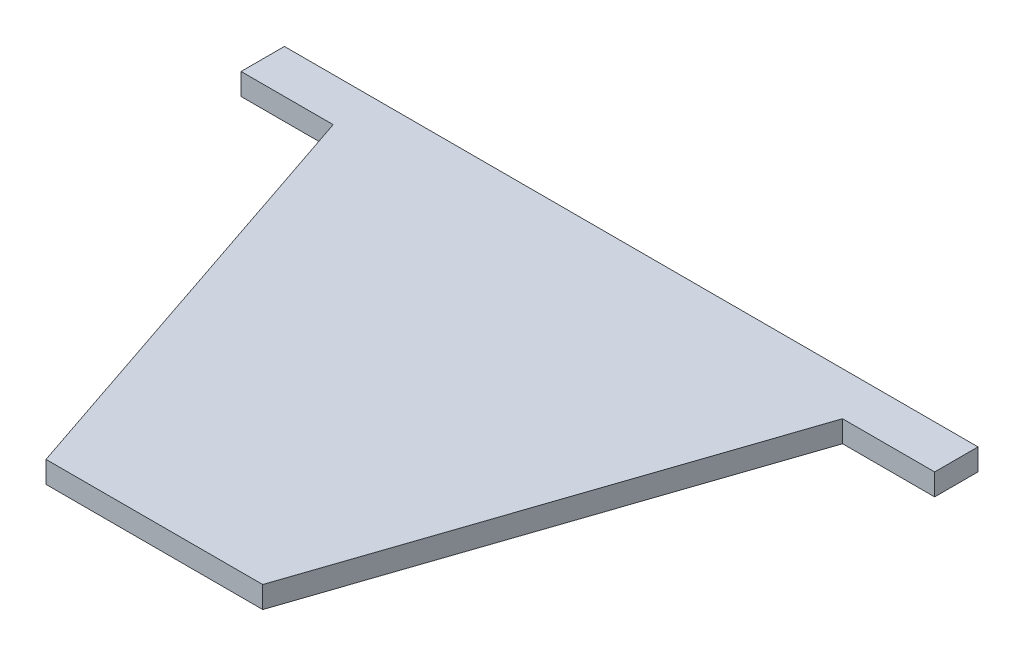
ISO-10303-21;
HEADER;
FILE_DESCRIPTION(('STEP AP214'),'2;1');
FILE_NAME('part.step','',(''),(''),'','','');
FILE_SCHEMA(('AUTOMOTIVE_DESIGN { 1 0 10303 214 1 1 1 1 }'));
ENDSEC;
DATA;
#1=APPLICATION_CONTEXT('core data for automotive mechanical design processes');
#2=APPLICATION_PROTOCOL_DEFINITION('international standard','automotive_design',2000,#1);
#3=PRODUCT_CONTEXT('',#1,'mechanical');
#4=PRODUCT('Part','Part','',(#3));
#5=PRODUCT_RELATED_PRODUCT_CATEGORY('part','',(#4));
#6=PRODUCT_DEFINITION_FORMATION('','',#4);
#7=PRODUCT_DEFINITION_CONTEXT('part definition',#1,'design');
#8=PRODUCT_DEFINITION('design','',#6,#7);
#9=PRODUCT_DEFINITION_SHAPE('','',#8);
#10=(LENGTH_UNIT() NAMED_UNIT(*) SI_UNIT(.MILLI.,.METRE.));
#11=(NAMED_UNIT(*) PLANE_ANGLE_UNIT() SI_UNIT($,.RADIAN.));
#12=(NAMED_UNIT(*) SI_UNIT($,.STERADIAN.) SOLID_ANGLE_UNIT());
#13=UNCERTAINTY_MEASURE_WITH_UNIT(LENGTH_MEASURE(1.E-05),#10,'distance_accuracy_value','');
#14=(GEOMETRIC_REPRESENTATION_CONTEXT(3) GLOBAL_UNCERTAINTY_ASSIGNED_CONTEXT((#13)) GLOBAL_UNIT_ASSIGNED_CONTEXT((#10,
#11,#12)) REPRESENTATION_CONTEXT('',''));
#15=CARTESIAN_POINT('',(0.,0.,0.));
#16=DIRECTION('',(0.,0.,1.));
#17=DIRECTION('',(1.,0.,0.));
#18=AXIS2_PLACEMENT_3D('',#15,#16,#17);
#19=CARTESIAN_POINT('',(-31.75,6.35,0.));
#20=DIRECTION('',(0.,0.,-1.));
#21=DIRECTION('',(-1.,0.,0.));
#22=AXIS2_PLACEMENT_3D('',#19,#20,#21);
#23=PLANE('',#22);
#24=DIRECTION('',(1.,0.,0.));
#25=VECTOR('',#24,1.);
#26=CARTESIAN_POINT('',(-31.75,0.,0.));
#27=LINE('',#26,#25);
#28=CARTESIAN_POINT('',(-31.75,0.,0.));
#29=VERTEX_POINT('',#28);
#30=CARTESIAN_POINT('',(31.75,0.,0.));
#31=VERTEX_POINT('',#30);
#32=EDGE_CURVE('E134',#29,#31,#27,.T.);
#33=ORIENTED_EDGE('',*,*,#32,.T.);
#34=DIRECTION('',(0.,-1.,0.));
#35=VECTOR('',#34,1.);
#36=CARTESIAN_POINT('',(31.75,6.35,0.));
#37=LINE('',#36,#35);
#38=CARTESIAN_POINT('',(31.75,6.35,0.));
#39=VERTEX_POINT('',#38);
#40=EDGE_CURVE('E11',#39,#31,#37,.T.);
#41=ORIENTED_EDGE('',*,*,#40,.F.);
#42=DIRECTION('',(1.,0.,0.));
#43=VECTOR('',#42,1.);
#44=CARTESIAN_POINT('',(-31.75,6.35,0.));
#45=LINE('',#44,#43);
#46=CARTESIAN_POINT('',(-31.75,6.35,0.));
#47=VERTEX_POINT('',#46);
#48=EDGE_CURVE('E148',#47,#39,#45,.T.);
#49=ORIENTED_EDGE('',*,*,#48,.F.);
#50=DIRECTION('',(0.,-1.,0.));
#51=VECTOR('',#50,1.);
#52=CARTESIAN_POINT('',(-31.75,6.35,0.));
#53=LINE('',#52,#51);
#54=EDGE_CURVE('E130',#47,#29,#53,.T.);
#55=ORIENTED_EDGE('',*,*,#54,.T.);
#56=EDGE_LOOP('',(#33,#41,#49,#55));
#57=FACE_BOUND('',#56,.T.);
#58=ADVANCED_FACE('F38',(#57),#23,.F.);
#59=CARTESIAN_POINT('',(74.6125,6.35,-127.));
#60=DIRECTION('',(-0.947492278987199,0.,-0.319778644158179));
#61=DIRECTION('',(-0.31977864415818,0.,0.947492278987199));
#62=AXIS2_PLACEMENT_3D('',#59,#60,#61);
#63=PLANE('',#62);
#64=DIRECTION('',(0.31977864415818,0.,-0.947492278987199));
#65=VECTOR('',#64,1.);
#66=CARTESIAN_POINT('',(74.6125,0.,-127.));
#67=LINE('',#66,#65);
#68=CARTESIAN_POINT('',(74.6125,0.,-127.));
#69=VERTEX_POINT('',#68);
#70=EDGE_CURVE('E137',#31,#69,#67,.T.);
#71=ORIENTED_EDGE('',*,*,#70,.T.);
#72=DIRECTION('',(0.,-1.,0.));
#73=VECTOR('',#72,1.);
#74=CARTESIAN_POINT('',(74.6125,6.35,-127.));
#75=LINE('',#74,#73);
#76=CARTESIAN_POINT('',(74.6125,6.35,-127.));
#77=VERTEX_POINT('',#76);
#78=EDGE_CURVE('E46',#77,#69,#75,.T.);
#79=ORIENTED_EDGE('',*,*,#78,.F.);
#80=DIRECTION('',(0.31977864415818,0.,-0.947492278987199));
#81=VECTOR('',#80,1.);
#82=CARTESIAN_POINT('',(74.6125,6.35,-127.));
#83=LINE('',#82,#81);
#84=EDGE_CURVE('E97',#39,#77,#83,.T.);
#85=ORIENTED_EDGE('',*,*,#84,.F.);
#86=ORIENTED_EDGE('',*,*,#40,.T.);
#87=EDGE_LOOP('',(#71,#79,#85,#86));
#88=FACE_BOUND('',#87,.T.);
#89=ADVANCED_FACE('F183',(#88),#63,.F.);
#90=CARTESIAN_POINT('',(101.6,6.35,-127.));
#91=DIRECTION('',(0.,0.,-1.));
#92=DIRECTION('',(-1.,0.,0.));
#93=AXIS2_PLACEMENT_3D('',#90,#91,#92);
#94=PLANE('',#93);
#95=DIRECTION('',(1.,0.,0.));
#96=VECTOR('',#95,1.);
#97=CARTESIAN_POINT('',(101.6,0.,-127.));
#98=LINE('',#97,#96);
#99=CARTESIAN_POINT('',(101.6,0.,-127.));
#100=VERTEX_POINT('',#99);
#101=EDGE_CURVE('E139',#69,#100,#98,.T.);
#102=ORIENTED_EDGE('',*,*,#101,.T.);
#103=DIRECTION('',(0.,-1.,0.));
#104=VECTOR('',#103,1.);
#105=CARTESIAN_POINT('',(101.6,6.35,-127.));
#106=LINE('',#105,#104);
#107=CARTESIAN_POINT('',(101.6,6.35,-127.));
#108=VERTEX_POINT('',#107);
#109=EDGE_CURVE('E155',#108,#100,#106,.T.);
#110=ORIENTED_EDGE('',*,*,#109,.F.);
#111=DIRECTION('',(1.,0.,0.));
#112=VECTOR('',#111,1.);
#113=CARTESIAN_POINT('',(101.6,6.35,-127.));
#114=LINE('',#113,#112);
#115=EDGE_CURVE('E163',#77,#108,#114,.T.);
#116=ORIENTED_EDGE('',*,*,#115,.F.);
#117=ORIENTED_EDGE('',*,*,#78,.T.);
#118=EDGE_LOOP('',(#102,#110,#116,#117));
#119=FACE_BOUND('',#118,.T.);
#120=ADVANCED_FACE('F161',(#119),#94,.F.);
#121=CARTESIAN_POINT('',(101.6,6.35,-139.7));
#122=DIRECTION('',(-1.,0.,0.));
#123=DIRECTION('',(0.,0.,1.));
#124=AXIS2_PLACEMENT_3D('',#121,#122,#123);
#125=PLANE('',#124);
#126=DIRECTION('',(0.,0.,-1.));
#127=VECTOR('',#126,1.);
#128=CARTESIAN_POINT('',(101.6,0.,-139.7));
#129=LINE('',#128,#127);
#130=CARTESIAN_POINT('',(101.6,0.,-139.7));
#131=VERTEX_POINT('',#130);
#132=EDGE_CURVE('E141',#100,#131,#129,.T.);
#133=ORIENTED_EDGE('',*,*,#132,.T.);
#134=DIRECTION('',(0.,-1.,0.));
#135=VECTOR('',#134,1.);
#136=CARTESIAN_POINT('',(101.6,6.35,-139.7));
#137=LINE('',#136,#135);
#138=CARTESIAN_POINT('',(101.6,6.35,-139.7));
#139=VERTEX_POINT('',#138);
#140=EDGE_CURVE('E152',#139,#131,#137,.T.);
#141=ORIENTED_EDGE('',*,*,#140,.F.);
#142=DIRECTION('',(0.,0.,-1.));
#143=VECTOR('',#142,1.);
#144=CARTESIAN_POINT('',(101.6,6.35,-139.7));
#145=LINE('',#144,#143);
#146=EDGE_CURVE('E175',#108,#139,#145,.T.);
#147=ORIENTED_EDGE('',*,*,#146,.F.);
#148=ORIENTED_EDGE('',*,*,#109,.T.);
#149=EDGE_LOOP('',(#133,#141,#147,#148));
#150=FACE_BOUND('',#149,.T.);
#151=ADVANCED_FACE('F171',(#150),#125,.F.);
#152=CARTESIAN_POINT('',(-101.6,6.35,-139.7));
#153=DIRECTION('',(0.,0.,1.));
#154=DIRECTION('',(1.,0.,0.));
#155=AXIS2_PLACEMENT_3D('',#152,#153,#154);
#156=PLANE('',#155);
#157=DIRECTION('',(-1.,0.,0.));
#158=VECTOR('',#157,1.);
#159=CARTESIAN_POINT('',(-101.6,0.,-139.7));
#160=LINE('',#159,#158);
#161=CARTESIAN_POINT('',(-101.6,0.,-139.7));
#162=VERTEX_POINT('',#161);
#163=EDGE_CURVE('E143',#131,#162,#160,.T.);
#164=ORIENTED_EDGE('',*,*,#163,.T.);
#165=DIRECTION('',(0.,-1.,0.));
#166=VECTOR('',#165,1.);
#167=CARTESIAN_POINT('',(-101.6,6.35,-139.7));
#168=LINE('',#167,#166);
#169=CARTESIAN_POINT('',(-101.6,6.35,-139.7));
#170=VERTEX_POINT('',#169);
#171=EDGE_CURVE('E125',#170,#162,#168,.T.);
#172=ORIENTED_EDGE('',*,*,#171,.F.);
#173=DIRECTION('',(-1.,0.,0.));
#174=VECTOR('',#173,1.);
#175=CARTESIAN_POINT('',(-101.6,6.35,-139.7));
#176=LINE('',#175,#174);
#177=EDGE_CURVE('E116',#139,#170,#176,.T.);
#178=ORIENTED_EDGE('',*,*,#177,.F.);
#179=ORIENTED_EDGE('',*,*,#140,.T.);
#180=EDGE_LOOP('',(#164,#172,#178,#179));
#181=FACE_BOUND('',#180,.T.);
#182=ADVANCED_FACE('F174',(#181),#156,.F.);
#183=CARTESIAN_POINT('',(-101.6,6.35,-139.7));
#184=DIRECTION('',(1.,0.,0.));
#185=DIRECTION('',(0.,0.,-1.));
#186=AXIS2_PLACEMENT_3D('',#183,#184,#185);
#187=PLANE('',#186);
#188=DIRECTION('',(0.,0.,1.));
#189=VECTOR('',#188,1.);
#190=CARTESIAN_POINT('',(-101.6,0.,-139.7));
#191=LINE('',#190,#189);
#192=CARTESIAN_POINT('',(-101.6,0.,-127.));
#193=VERTEX_POINT('',#192);
#194=EDGE_CURVE('E124',#162,#193,#191,.T.);
#195=ORIENTED_EDGE('',*,*,#194,.T.);
#196=DIRECTION('',(0.,-1.,0.));
#197=VECTOR('',#196,1.);
#198=CARTESIAN_POINT('',(-101.6,6.35,-127.));
#199=LINE('',#198,#197);
#200=CARTESIAN_POINT('',(-101.6,6.35,-127.));
#201=VERTEX_POINT('',#200);
#202=EDGE_CURVE('E121',#201,#193,#199,.T.);
#203=ORIENTED_EDGE('',*,*,#202,.F.);
#204=DIRECTION('',(0.,0.,1.));
#205=VECTOR('',#204,1.);
#206=CARTESIAN_POINT('',(-101.6,6.35,-139.7));
#207=LINE('',#206,#205);
#208=EDGE_CURVE('E110',#170,#201,#207,.T.);
#209=ORIENTED_EDGE('',*,*,#208,.F.);
#210=ORIENTED_EDGE('',*,*,#171,.T.);
#211=EDGE_LOOP('',(#195,#203,#209,#210));
#212=FACE_BOUND('',#211,.T.);
#213=ADVANCED_FACE('F122',(#212),#187,.F.);
#214=CARTESIAN_POINT('',(-101.6,6.35,-127.));
#215=DIRECTION('',(0.,0.,-1.));
#216=DIRECTION('',(-1.,0.,0.));
#217=AXIS2_PLACEMENT_3D('',#214,#215,#216);
#218=PLANE('',#217);
#219=DIRECTION('',(1.,0.,0.));
#220=VECTOR('',#219,1.);
#221=CARTESIAN_POINT('',(-101.6,0.,-127.));
#222=LINE('',#221,#220);
#223=CARTESIAN_POINT('',(-74.6125,0.,-127.));
#224=VERTEX_POINT('',#223);
#225=EDGE_CURVE('E83',#193,#224,#222,.T.);
#226=ORIENTED_EDGE('',*,*,#225,.T.);
#227=DIRECTION('',(0.,-1.,0.));
#228=VECTOR('',#227,1.);
#229=CARTESIAN_POINT('',(-74.6125,6.35,-127.));
#230=LINE('',#229,#228);
#231=CARTESIAN_POINT('',(-74.6125,6.35,-127.));
#232=VERTEX_POINT('',#231);
#233=EDGE_CURVE('E126',#232,#224,#230,.T.);
#234=ORIENTED_EDGE('',*,*,#233,.F.);
#235=DIRECTION('',(1.,0.,0.));
#236=VECTOR('',#235,1.);
#237=CARTESIAN_POINT('',(-101.6,6.35,-127.));
#238=LINE('',#237,#236);
#239=EDGE_CURVE('E114',#201,#232,#238,.T.);
#240=ORIENTED_EDGE('',*,*,#239,.F.);
#241=ORIENTED_EDGE('',*,*,#202,.T.);
#242=EDGE_LOOP('',(#226,#234,#240,#241));
#243=FACE_BOUND('',#242,.T.);
#244=ADVANCED_FACE('F128',(#243),#218,.F.);
#245=CARTESIAN_POINT('',(-74.6125,6.35,-127.));
#246=DIRECTION('',(0.947492278987199,0.,-0.31977864415818));
#247=DIRECTION('',(-0.31977864415818,0.,-0.947492278987199));
#248=AXIS2_PLACEMENT_3D('',#245,#246,#247);
#249=PLANE('',#248);
#250=DIRECTION('',(0.31977864415818,0.,0.947492278987199));
#251=VECTOR('',#250,1.);
#252=CARTESIAN_POINT('',(-74.6125,0.,-127.));
#253=LINE('',#252,#251);
#254=EDGE_CURVE('E89',#224,#29,#253,.T.);
#255=ORIENTED_EDGE('',*,*,#254,.T.);
#256=ORIENTED_EDGE('',*,*,#54,.F.);
#257=DIRECTION('',(0.31977864415818,0.,0.947492278987199));
#258=VECTOR('',#257,1.);
#259=CARTESIAN_POINT('',(-74.6125,6.35,-127.));
#260=LINE('',#259,#258);
#261=EDGE_CURVE('E54',#232,#47,#260,.T.);
#262=ORIENTED_EDGE('',*,*,#261,.F.);
#263=ORIENTED_EDGE('',*,*,#233,.T.);
#264=EDGE_LOOP('',(#255,#256,#262,#263));
#265=FACE_BOUND('',#264,.T.);
#266=ADVANCED_FACE('F199',(#265),#249,.F.);
#267=CARTESIAN_POINT('',(0.,6.35,0.));
#268=DIRECTION('',(0.,-1.,0.));
#269=DIRECTION('',(0.,0.,-1.));
#270=AXIS2_PLACEMENT_3D('',#267,#268,#269);
#271=PLANE('',#270);
#272=ORIENTED_EDGE('',*,*,#48,.T.);
#273=ORIENTED_EDGE('',*,*,#84,.T.);
#274=ORIENTED_EDGE('',*,*,#115,.T.);
#275=ORIENTED_EDGE('',*,*,#146,.T.);
#276=ORIENTED_EDGE('',*,*,#177,.T.);
#277=ORIENTED_EDGE('',*,*,#208,.T.);
#278=ORIENTED_EDGE('',*,*,#239,.T.);
#279=ORIENTED_EDGE('',*,*,#261,.T.);
#280=EDGE_LOOP('',(#272,#273,#274,#275,#276,#277,#278,#279));
#281=FACE_BOUND('',#280,.T.);
#282=ADVANCED_FACE('F112',(#281),#271,.F.);
#283=CARTESIAN_POINT('',(0.,0.,0.));
#284=DIRECTION('',(0.,-1.,0.));
#285=DIRECTION('',(0.,0.,-1.));
#286=AXIS2_PLACEMENT_3D('',#283,#284,#285);
#287=PLANE('',#286);
#288=ORIENTED_EDGE('',*,*,#32,.F.);
#289=ORIENTED_EDGE('',*,*,#254,.F.);
#290=ORIENTED_EDGE('',*,*,#225,.F.);
#291=ORIENTED_EDGE('',*,*,#194,.F.);
#292=ORIENTED_EDGE('',*,*,#163,.F.);
#293=ORIENTED_EDGE('',*,*,#132,.F.);
#294=ORIENTED_EDGE('',*,*,#101,.F.);
#295=ORIENTED_EDGE('',*,*,#70,.F.);
#296=EDGE_LOOP('',(#288,#289,#290,#291,#292,#293,#294,#295));
#297=FACE_BOUND('',#296,.T.);
#298=ADVANCED_FACE('F167',(#297),#287,.T.);
#299=CLOSED_SHELL('',(#58,#89,#120,#151,#182,#213,#244,#266,#282,#298));
#300=MANIFOLD_SOLID_BREP('B2',#299);
#301=ADVANCED_BREP_SHAPE_REPRESENTATION('',(#18,#300),#14);
#302=SHAPE_DEFINITION_REPRESENTATION(#9,#301);
ENDSEC;
END-ISO-10303-21;
